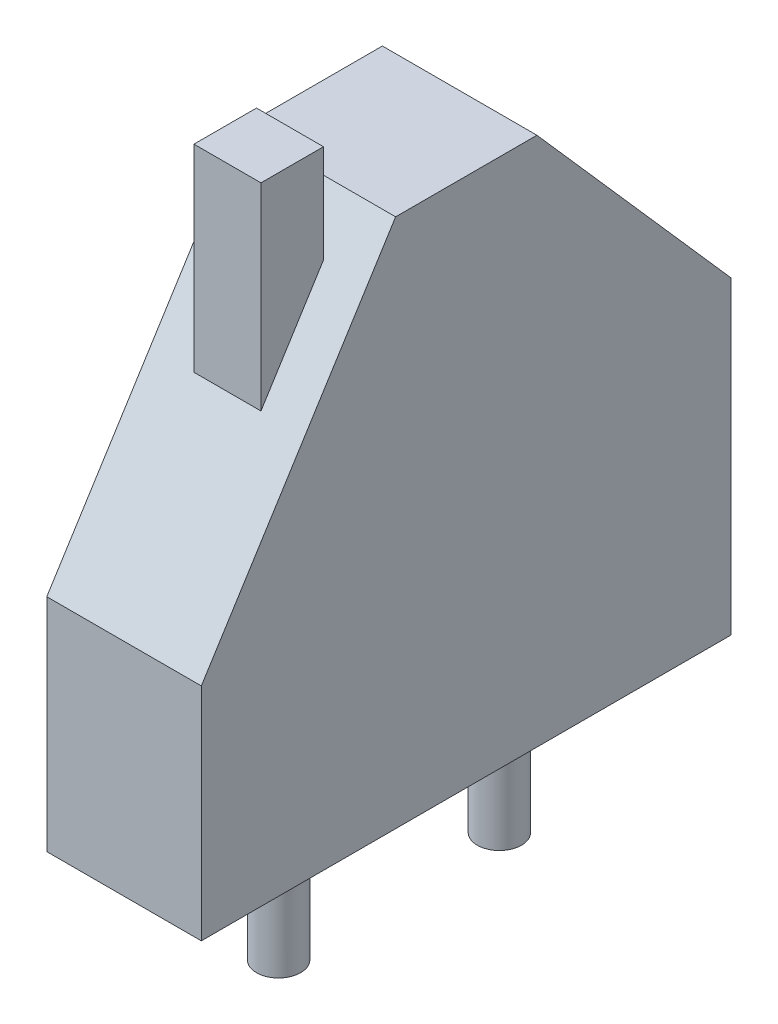
ISO-10303-21;
HEADER;
FILE_DESCRIPTION(('STEP AP214'),'2;1');
FILE_NAME('part.step','',(''),(''),'','','');
FILE_SCHEMA(('AUTOMOTIVE_DESIGN { 1 0 10303 214 1 1 1 1 }'));
ENDSEC;
DATA;
#1=APPLICATION_CONTEXT('core data for automotive mechanical design processes');
#2=APPLICATION_PROTOCOL_DEFINITION('international standard','automotive_design',2000,#1);
#3=PRODUCT_CONTEXT('',#1,'mechanical');
#4=PRODUCT('Part','Part','',(#3));
#5=PRODUCT_RELATED_PRODUCT_CATEGORY('part','',(#4));
#6=PRODUCT_DEFINITION_FORMATION('','',#4);
#7=PRODUCT_DEFINITION_CONTEXT('part definition',#1,'design');
#8=PRODUCT_DEFINITION('design','',#6,#7);
#9=PRODUCT_DEFINITION_SHAPE('','',#8);
#10=(LENGTH_UNIT() NAMED_UNIT(*) SI_UNIT(.MILLI.,.METRE.));
#11=(NAMED_UNIT(*) PLANE_ANGLE_UNIT() SI_UNIT($,.RADIAN.));
#12=(NAMED_UNIT(*) SI_UNIT($,.STERADIAN.) SOLID_ANGLE_UNIT());
#13=UNCERTAINTY_MEASURE_WITH_UNIT(LENGTH_MEASURE(1.E-05),#10,'distance_accuracy_value','');
#14=(GEOMETRIC_REPRESENTATION_CONTEXT(3) GLOBAL_UNCERTAINTY_ASSIGNED_CONTEXT((#13)) GLOBAL_UNIT_ASSIGNED_CONTEXT((#10,
#11,#12)) REPRESENTATION_CONTEXT('',''));
#15=CARTESIAN_POINT('',(0.,0.,0.));
#16=DIRECTION('',(0.,0.,1.));
#17=DIRECTION('',(1.,0.,0.));
#18=AXIS2_PLACEMENT_3D('',#15,#16,#17);
#19=CARTESIAN_POINT('',(-1.75,0.,5.99999999999999));
#20=DIRECTION('',(0.,1.,0.));
#21=DIRECTION('',(0.,0.,1.));
#22=AXIS2_PLACEMENT_3D('',#19,#20,#21);
#23=PLANE('',#22);
#24=CARTESIAN_POINT('',(0.,0.,2.5));
#25=DIRECTION('',(0.,1.,0.));
#26=DIRECTION('',(0.,0.,1.));
#27=AXIS2_PLACEMENT_3D('',#24,#25,#26);
#28=CIRCLE('',#27,0.5);
#29=CARTESIAN_POINT('',(0.,0.,3.));
#30=VERTEX_POINT('',#29);
#31=EDGE_CURVE('E184',#30,#30,#28,.F.);
#32=ORIENTED_EDGE('',*,*,#31,.F.);
#33=EDGE_LOOP('',(#32));
#34=FACE_BOUND('',#33,.T.);
#35=DIRECTION('',(0.,0.,1.));
#36=VECTOR('',#35,1.);
#37=CARTESIAN_POINT('',(-1.75,0.,-5.99999999999999));
#38=LINE('',#37,#36);
#39=CARTESIAN_POINT('',(-1.75,0.,-5.99999999999999));
#40=VERTEX_POINT('',#39);
#41=CARTESIAN_POINT('',(-1.75,0.,5.99999999999999));
#42=VERTEX_POINT('',#41);
#43=EDGE_CURVE('E159',#40,#42,#38,.T.);
#44=ORIENTED_EDGE('',*,*,#43,.F.);
#45=DIRECTION('',(-1.,0.,0.));
#46=VECTOR('',#45,1.);
#47=CARTESIAN_POINT('',(-1.75,0.,-5.99999999999999));
#48=LINE('',#47,#46);
#49=CARTESIAN_POINT('',(1.75000000000001,0.,-5.99999999999999));
#50=VERTEX_POINT('',#49);
#51=EDGE_CURVE('E163',#50,#40,#48,.T.);
#52=ORIENTED_EDGE('',*,*,#51,.F.);
#53=DIRECTION('',(0.,0.,-1.));
#54=VECTOR('',#53,1.);
#55=CARTESIAN_POINT('',(1.75000000000001,0.,-5.99999999999999));
#56=LINE('',#55,#54);
#57=CARTESIAN_POINT('',(1.75000000000001,0.,5.99999999999999));
#58=VERTEX_POINT('',#57);
#59=EDGE_CURVE('E172',#58,#50,#56,.T.);
#60=ORIENTED_EDGE('',*,*,#59,.F.);
#61=DIRECTION('',(1.,0.,0.));
#62=VECTOR('',#61,1.);
#63=CARTESIAN_POINT('',(-1.75,0.,5.99999999999999));
#64=LINE('',#63,#62);
#65=EDGE_CURVE('E169',#42,#58,#64,.T.);
#66=ORIENTED_EDGE('',*,*,#65,.F.);
#67=EDGE_LOOP('',(#44,#52,#60,#66));
#68=FACE_BOUND('',#67,.T.);
#69=CARTESIAN_POINT('',(0.,0.,-2.5));
#70=DIRECTION('',(0.,1.,0.));
#71=DIRECTION('',(0.,0.,1.));
#72=AXIS2_PLACEMENT_3D('',#69,#70,#71);
#73=CIRCLE('',#72,0.5);
#74=CARTESIAN_POINT('',(0.,0.,-2.));
#75=VERTEX_POINT('',#74);
#76=EDGE_CURVE('E187',#75,#75,#73,.F.);
#77=ORIENTED_EDGE('',*,*,#76,.F.);
#78=EDGE_LOOP('',(#77));
#79=FACE_BOUND('',#78,.T.);
#80=ADVANCED_FACE('F33',(#34,#68,#79),#23,.F.);
#81=CARTESIAN_POINT('',(-1.75,12.,-5.99999999999999));
#82=DIRECTION('',(1.,0.,0.));
#83=DIRECTION('',(0.,0.,-1.));
#84=AXIS2_PLACEMENT_3D('',#81,#82,#83);
#85=PLANE('',#84);
#86=DIRECTION('',(0.,0.,1.));
#87=VECTOR('',#86,1.);
#88=CARTESIAN_POINT('',(-1.75,12.,-5.99999999999999));
#89=LINE('',#88,#87);
#90=CARTESIAN_POINT('',(-1.75,12.,-1.6));
#91=VERTEX_POINT('',#90);
#92=CARTESIAN_POINT('',(-1.75,12.,1.6));
#93=VERTEX_POINT('',#92);
#94=EDGE_CURVE('E160',#91,#93,#89,.T.);
#95=ORIENTED_EDGE('',*,*,#94,.F.);
#96=DIRECTION('',(0.,-0.750713516922756,-0.660627894892024));
#97=VECTOR('',#96,1.);
#98=CARTESIAN_POINT('',(-1.75,9.81785392245266,-3.52028854824165));
#99=LINE('',#98,#97);
#100=CARTESIAN_POINT('',(-1.75,7.,-5.99999999999999));
#101=VERTEX_POINT('',#100);
#102=EDGE_CURVE('E56',#91,#101,#99,.T.);
#103=ORIENTED_EDGE('',*,*,#102,.T.);
#104=DIRECTION('',(0.,-1.,0.));
#105=VECTOR('',#104,1.);
#106=CARTESIAN_POINT('',(-1.75,12.,-5.99999999999999));
#107=LINE('',#106,#105);
#108=EDGE_CURVE('E166',#101,#40,#107,.T.);
#109=ORIENTED_EDGE('',*,*,#108,.T.);
#110=ORIENTED_EDGE('',*,*,#43,.T.);
#111=DIRECTION('',(0.,-1.,0.));
#112=VECTOR('',#111,1.);
#113=CARTESIAN_POINT('',(-1.75,12.,5.99999999999999));
#114=LINE('',#113,#112);
#115=CARTESIAN_POINT('',(-1.75,5.,5.99999999999999));
#116=VERTEX_POINT('',#115);
#117=EDGE_CURVE('E182',#116,#42,#114,.T.);
#118=ORIENTED_EDGE('',*,*,#117,.F.);
#119=DIRECTION('',(0.,0.846636549211005,-0.532171545218345));
#120=VECTOR('',#119,1.);
#121=CARTESIAN_POINT('',(-1.75,15.4242246928028,-0.552369806904613));
#122=LINE('',#121,#120);
#123=EDGE_CURVE('E150',#116,#93,#122,.T.);
#124=ORIENTED_EDGE('',*,*,#123,.T.);
#125=EDGE_LOOP('',(#95,#103,#109,#110,#118,#124));
#126=FACE_BOUND('',#125,.T.);
#127=ADVANCED_FACE('F35',(#126),#85,.F.);
#128=CARTESIAN_POINT('',(-1.75,12.,5.99999999999999));
#129=DIRECTION('',(0.,0.,-1.));
#130=DIRECTION('',(-1.,0.,0.));
#131=AXIS2_PLACEMENT_3D('',#128,#129,#130);
#132=PLANE('',#131);
#133=DIRECTION('',(0.,-1.,0.));
#134=VECTOR('',#133,1.);
#135=CARTESIAN_POINT('',(1.75000000000001,12.,5.99999999999999));
#136=LINE('',#135,#134);
#137=CARTESIAN_POINT('',(1.75000000000001,5.,5.99999999999999));
#138=VERTEX_POINT('',#137);
#139=EDGE_CURVE('E180',#138,#58,#136,.T.);
#140=ORIENTED_EDGE('',*,*,#139,.F.);
#141=DIRECTION('',(1.,0.,0.));
#142=VECTOR('',#141,1.);
#143=CARTESIAN_POINT('',(-3.24999999999999,5.,5.99999999999999));
#144=LINE('',#143,#142);
#145=EDGE_CURVE('E148',#116,#138,#144,.T.);
#146=ORIENTED_EDGE('',*,*,#145,.F.);
#147=ORIENTED_EDGE('',*,*,#117,.T.);
#148=ORIENTED_EDGE('',*,*,#65,.T.);
#149=EDGE_LOOP('',(#140,#146,#147,#148));
#150=FACE_BOUND('',#149,.T.);
#151=ADVANCED_FACE('F220',(#150),#132,.F.);
#152=CARTESIAN_POINT('',(1.75000000000001,12.,-5.99999999999999));
#153=DIRECTION('',(-1.,0.,0.));
#154=DIRECTION('',(0.,0.,1.));
#155=AXIS2_PLACEMENT_3D('',#152,#153,#154);
#156=PLANE('',#155);
#157=DIRECTION('',(0.,-1.,0.));
#158=VECTOR('',#157,1.);
#159=CARTESIAN_POINT('',(1.75000000000001,12.,-5.99999999999999));
#160=LINE('',#159,#158);
#161=CARTESIAN_POINT('',(1.75000000000001,7.,-5.99999999999999));
#162=VERTEX_POINT('',#161);
#163=EDGE_CURVE('E178',#162,#50,#160,.T.);
#164=ORIENTED_EDGE('',*,*,#163,.F.);
#165=DIRECTION('',(0.,-0.750713516922756,-0.660627894892024));
#166=VECTOR('',#165,1.);
#167=CARTESIAN_POINT('',(1.75000000000001,12.,-1.6));
#168=LINE('',#167,#166);
#169=CARTESIAN_POINT('',(1.75000000000001,12.,-1.6));
#170=VERTEX_POINT('',#169);
#171=EDGE_CURVE('E136',#170,#162,#168,.T.);
#172=ORIENTED_EDGE('',*,*,#171,.F.);
#173=DIRECTION('',(0.,0.,-1.));
#174=VECTOR('',#173,1.);
#175=CARTESIAN_POINT('',(1.75000000000001,12.,-5.99999999999999));
#176=LINE('',#175,#174);
#177=CARTESIAN_POINT('',(1.75000000000001,12.,1.6));
#178=VERTEX_POINT('',#177);
#179=EDGE_CURVE('E162',#178,#170,#176,.T.);
#180=ORIENTED_EDGE('',*,*,#179,.F.);
#181=DIRECTION('',(0.,0.846636549211005,-0.532171545218345));
#182=VECTOR('',#181,1.);
#183=CARTESIAN_POINT('',(1.75000000000001,12.,1.6));
#184=LINE('',#183,#182);
#185=EDGE_CURVE('E146',#138,#178,#184,.T.);
#186=ORIENTED_EDGE('',*,*,#185,.F.);
#187=ORIENTED_EDGE('',*,*,#139,.T.);
#188=ORIENTED_EDGE('',*,*,#59,.T.);
#189=EDGE_LOOP('',(#164,#172,#180,#186,#187,#188));
#190=FACE_BOUND('',#189,.T.);
#191=ADVANCED_FACE('F231',(#190),#156,.F.);
#192=CARTESIAN_POINT('',(-1.75,12.,-5.99999999999999));
#193=DIRECTION('',(0.,0.,1.));
#194=DIRECTION('',(1.,0.,0.));
#195=AXIS2_PLACEMENT_3D('',#192,#193,#194);
#196=PLANE('',#195);
#197=ORIENTED_EDGE('',*,*,#108,.F.);
#198=DIRECTION('',(1.,0.,0.));
#199=VECTOR('',#198,1.);
#200=CARTESIAN_POINT('',(-3.24999999999999,7.,-5.99999999999999));
#201=LINE('',#200,#199);
#202=EDGE_CURVE('E142',#101,#162,#201,.T.);
#203=ORIENTED_EDGE('',*,*,#202,.T.);
#204=ORIENTED_EDGE('',*,*,#163,.T.);
#205=ORIENTED_EDGE('',*,*,#51,.T.);
#206=EDGE_LOOP('',(#197,#203,#204,#205));
#207=FACE_BOUND('',#206,.T.);
#208=ADVANCED_FACE('F228',(#207),#196,.F.);
#209=CARTESIAN_POINT('',(-1.75,12.,5.99999999999999));
#210=DIRECTION('',(0.,1.,0.));
#211=DIRECTION('',(0.,0.,1.));
#212=AXIS2_PLACEMENT_3D('',#209,#210,#211);
#213=PLANE('',#212);
#214=DIRECTION('',(1.,0.,0.));
#215=VECTOR('',#214,1.);
#216=CARTESIAN_POINT('',(-1.75000000000001,12.,-1.6));
#217=LINE('',#216,#215);
#218=EDGE_CURVE('E193',#91,#170,#217,.T.);
#219=ORIENTED_EDGE('',*,*,#218,.F.);
#220=ORIENTED_EDGE('',*,*,#94,.T.);
#221=DIRECTION('',(-1.,0.,0.));
#222=VECTOR('',#221,1.);
#223=CARTESIAN_POINT('',(-1.75,12.,1.6));
#224=LINE('',#223,#222);
#225=EDGE_CURVE('E190',#178,#93,#224,.T.);
#226=ORIENTED_EDGE('',*,*,#225,.F.);
#227=ORIENTED_EDGE('',*,*,#179,.T.);
#228=EDGE_LOOP('',(#219,#220,#226,#227));
#229=FACE_BOUND('',#228,.T.);
#230=ADVANCED_FACE('F226',(#229),#213,.T.);
#231=CARTESIAN_POINT('',(0.,-3.,2.5));
#232=DIRECTION('',(0.,1.,0.));
#233=DIRECTION('',(0.,0.,1.));
#234=AXIS2_PLACEMENT_3D('',#231,#232,#233);
#235=CYLINDRICAL_SURFACE('',#234,0.5);
#236=CARTESIAN_POINT('',(0.,-3.,2.5));
#237=DIRECTION('',(0.,-1.,0.));
#238=DIRECTION('',(0.,0.,-1.));
#239=AXIS2_PLACEMENT_3D('',#236,#237,#238);
#240=CIRCLE('',#239,0.5);
#241=CARTESIAN_POINT('',(0.,-3.,2.));
#242=VERTEX_POINT('',#241);
#243=EDGE_CURVE('E156',#242,#242,#240,.T.);
#244=ORIENTED_EDGE('',*,*,#243,.F.);
#245=EDGE_LOOP('',(#244));
#246=FACE_BOUND('',#245,.T.);
#247=ORIENTED_EDGE('',*,*,#31,.T.);
#248=EDGE_LOOP('',(#247));
#249=FACE_BOUND('',#248,.T.);
#250=ADVANCED_FACE('F275',(#246,#249),#235,.T.);
#251=CARTESIAN_POINT('',(0.,-3.,2.5));
#252=DIRECTION('',(0.,-1.,0.));
#253=DIRECTION('',(0.,0.,-1.));
#254=AXIS2_PLACEMENT_3D('',#251,#252,#253);
#255=PLANE('',#254);
#256=ORIENTED_EDGE('',*,*,#243,.T.);
#257=EDGE_LOOP('',(#256));
#258=FACE_BOUND('',#257,.T.);
#259=ADVANCED_FACE('F272',(#258),#255,.T.);
#260=CARTESIAN_POINT('',(0.,-3.,-2.5));
#261=DIRECTION('',(0.,1.,0.));
#262=DIRECTION('',(0.,0.,1.));
#263=AXIS2_PLACEMENT_3D('',#260,#261,#262);
#264=CYLINDRICAL_SURFACE('',#263,0.5);
#265=CARTESIAN_POINT('',(0.,-3.,-2.5));
#266=DIRECTION('',(0.,-1.,0.));
#267=DIRECTION('',(0.,0.,-1.));
#268=AXIS2_PLACEMENT_3D('',#265,#266,#267);
#269=CIRCLE('',#268,0.5);
#270=CARTESIAN_POINT('',(0.,-3.,-3.));
#271=VERTEX_POINT('',#270);
#272=EDGE_CURVE('E153',#271,#271,#269,.T.);
#273=ORIENTED_EDGE('',*,*,#272,.F.);
#274=EDGE_LOOP('',(#273));
#275=FACE_BOUND('',#274,.T.);
#276=ORIENTED_EDGE('',*,*,#76,.T.);
#277=EDGE_LOOP('',(#276));
#278=FACE_BOUND('',#277,.T.);
#279=ADVANCED_FACE('F268',(#275,#278),#264,.T.);
#280=CARTESIAN_POINT('',(0.,-3.,-2.5));
#281=DIRECTION('',(0.,-1.,0.));
#282=DIRECTION('',(0.,0.,-1.));
#283=AXIS2_PLACEMENT_3D('',#280,#281,#282);
#284=PLANE('',#283);
#285=ORIENTED_EDGE('',*,*,#272,.T.);
#286=EDGE_LOOP('',(#285));
#287=FACE_BOUND('',#286,.T.);
#288=ADVANCED_FACE('F263',(#287),#284,.T.);
#289=CARTESIAN_POINT('',(-3.24999999999999,12.,1.6));
#290=DIRECTION('',(0.,-0.532171545218345,-0.846636549211005));
#291=DIRECTION('',(0.,0.846636549211005,-0.532171545218345));
#292=AXIS2_PLACEMENT_3D('',#289,#290,#291);
#293=PLANE('',#292);
#294=DIRECTION('',(-1.,0.,0.));
#295=VECTOR('',#294,1.);
#296=CARTESIAN_POINT('',(-3.24999999999999,8.72559305547958,3.6581986508414));
#297=LINE('',#296,#295);
#298=CARTESIAN_POINT('',(0.758612623446356,8.72559305547958,3.6581986508414));
#299=VERTEX_POINT('',#298);
#300=CARTESIAN_POINT('',(-0.758612623446356,8.72559305547958,3.6581986508414));
#301=VERTEX_POINT('',#300);
#302=EDGE_CURVE('E41',#299,#301,#297,.T.);
#303=ORIENTED_EDGE('',*,*,#302,.T.);
#304=DIRECTION('',(0.,0.846636549211005,-0.532171545218345));
#305=VECTOR('',#304,1.);
#306=CARTESIAN_POINT('',(-0.758612623446356,12.,1.6));
#307=LINE('',#306,#305);
#308=CARTESIAN_POINT('',(-0.758612623446356,10.9784426645021,2.24212175374152));
#309=VERTEX_POINT('',#308);
#310=EDGE_CURVE('E11',#301,#309,#307,.T.);
#311=ORIENTED_EDGE('',*,*,#310,.T.);
#312=DIRECTION('',(1.,0.,0.));
#313=VECTOR('',#312,1.);
#314=CARTESIAN_POINT('',(-3.24999999999999,10.9784426645021,2.24212175374152));
#315=LINE('',#314,#313);
#316=CARTESIAN_POINT('',(0.758612623446356,10.9784426645021,2.24212175374152));
#317=VERTEX_POINT('',#316);
#318=EDGE_CURVE('E113',#309,#317,#315,.T.);
#319=ORIENTED_EDGE('',*,*,#318,.T.);
#320=DIRECTION('',(0.,-0.846636549211005,0.532171545218345));
#321=VECTOR('',#320,1.);
#322=CARTESIAN_POINT('',(0.758612623446356,12.,1.6));
#323=LINE('',#322,#321);
#324=EDGE_CURVE('E196',#317,#299,#323,.T.);
#325=ORIENTED_EDGE('',*,*,#324,.T.);
#326=EDGE_LOOP('',(#303,#311,#319,#325));
#327=FACE_BOUND('',#326,.T.);
#328=ORIENTED_EDGE('',*,*,#145,.T.);
#329=ORIENTED_EDGE('',*,*,#185,.T.);
#330=ORIENTED_EDGE('',*,*,#225,.T.);
#331=ORIENTED_EDGE('',*,*,#123,.F.);
#332=EDGE_LOOP('',(#328,#329,#330,#331));
#333=FACE_BOUND('',#332,.T.);
#334=ADVANCED_FACE('F200',(#327,#333),#293,.F.);
#335=CARTESIAN_POINT('',(-3.24999999999999,12.,-1.6));
#336=DIRECTION('',(0.,-0.660627894892024,0.750713516922756));
#337=DIRECTION('',(0.,-0.750713516922756,-0.660627894892024));
#338=AXIS2_PLACEMENT_3D('',#335,#336,#337);
#339=PLANE('',#338);
#340=ORIENTED_EDGE('',*,*,#218,.T.);
#341=ORIENTED_EDGE('',*,*,#171,.T.);
#342=ORIENTED_EDGE('',*,*,#202,.F.);
#343=ORIENTED_EDGE('',*,*,#102,.F.);
#344=EDGE_LOOP('',(#340,#341,#342,#343));
#345=FACE_BOUND('',#344,.T.);
#346=ADVANCED_FACE('F255',(#345),#339,.F.);
#347=CARTESIAN_POINT('',(-0.758612623446356,13.2,3.6581986508414));
#348=DIRECTION('',(-1.,0.,0.));
#349=DIRECTION('',(0.,0.,1.));
#350=AXIS2_PLACEMENT_3D('',#347,#348,#349);
#351=PLANE('',#350);
#352=ORIENTED_EDGE('',*,*,#310,.F.);
#353=DIRECTION('',(0.,-1.,0.));
#354=VECTOR('',#353,1.);
#355=CARTESIAN_POINT('',(-0.758612623446356,13.2,3.6581986508414));
#356=LINE('',#355,#354);
#357=CARTESIAN_POINT('',(-0.758612623446356,13.2,3.6581986508414));
#358=VERTEX_POINT('',#357);
#359=EDGE_CURVE('E130',#358,#301,#356,.T.);
#360=ORIENTED_EDGE('',*,*,#359,.F.);
#361=DIRECTION('',(0.,0.,-1.));
#362=VECTOR('',#361,1.);
#363=CARTESIAN_POINT('',(-0.758612623446356,13.2,3.6581986508414));
#364=LINE('',#363,#362);
#365=CARTESIAN_POINT('',(-0.758612623446356,13.2,2.24212175374152));
#366=VERTEX_POINT('',#365);
#367=EDGE_CURVE('E123',#358,#366,#364,.T.);
#368=ORIENTED_EDGE('',*,*,#367,.T.);
#369=DIRECTION('',(0.,-1.,0.));
#370=VECTOR('',#369,1.);
#371=CARTESIAN_POINT('',(-0.758612623446356,13.2,2.24212175374152));
#372=LINE('',#371,#370);
#373=EDGE_CURVE('E108',#366,#309,#372,.T.);
#374=ORIENTED_EDGE('',*,*,#373,.T.);
#375=EDGE_LOOP('',(#352,#360,#368,#374));
#376=FACE_BOUND('',#375,.T.);
#377=ADVANCED_FACE('F128',(#376),#351,.T.);
#378=CARTESIAN_POINT('',(-0.758612623446356,13.2,3.6581986508414));
#379=DIRECTION('',(0.,0.,1.));
#380=DIRECTION('',(1.,0.,0.));
#381=AXIS2_PLACEMENT_3D('',#378,#379,#380);
#382=PLANE('',#381);
#383=ORIENTED_EDGE('',*,*,#302,.F.);
#384=DIRECTION('',(0.,-1.,0.));
#385=VECTOR('',#384,1.);
#386=CARTESIAN_POINT('',(0.758612623446356,13.2,3.6581986508414));
#387=LINE('',#386,#385);
#388=CARTESIAN_POINT('',(0.758612623446356,13.2,3.6581986508414));
#389=VERTEX_POINT('',#388);
#390=EDGE_CURVE('E137',#389,#299,#387,.T.);
#391=ORIENTED_EDGE('',*,*,#390,.F.);
#392=DIRECTION('',(-1.,0.,0.));
#393=VECTOR('',#392,1.);
#394=CARTESIAN_POINT('',(-0.758612623446356,13.2,3.6581986508414));
#395=LINE('',#394,#393);
#396=EDGE_CURVE('E116',#389,#358,#395,.T.);
#397=ORIENTED_EDGE('',*,*,#396,.T.);
#398=ORIENTED_EDGE('',*,*,#359,.T.);
#399=EDGE_LOOP('',(#383,#391,#397,#398));
#400=FACE_BOUND('',#399,.T.);
#401=ADVANCED_FACE('F203',(#400),#382,.T.);
#402=CARTESIAN_POINT('',(0.758612623446356,13.2,3.6581986508414));
#403=DIRECTION('',(1.,0.,0.));
#404=DIRECTION('',(0.,0.,-1.));
#405=AXIS2_PLACEMENT_3D('',#402,#403,#404);
#406=PLANE('',#405);
#407=ORIENTED_EDGE('',*,*,#324,.F.);
#408=DIRECTION('',(0.,-1.,0.));
#409=VECTOR('',#408,1.);
#410=CARTESIAN_POINT('',(0.758612623446356,13.2,2.24212175374152));
#411=LINE('',#410,#409);
#412=CARTESIAN_POINT('',(0.758612623446356,13.2,2.24212175374152));
#413=VERTEX_POINT('',#412);
#414=EDGE_CURVE('E48',#413,#317,#411,.T.);
#415=ORIENTED_EDGE('',*,*,#414,.F.);
#416=DIRECTION('',(0.,0.,1.));
#417=VECTOR('',#416,1.);
#418=CARTESIAN_POINT('',(0.758612623446356,13.2,3.6581986508414));
#419=LINE('',#418,#417);
#420=EDGE_CURVE('E126',#413,#389,#419,.T.);
#421=ORIENTED_EDGE('',*,*,#420,.T.);
#422=ORIENTED_EDGE('',*,*,#390,.T.);
#423=EDGE_LOOP('',(#407,#415,#421,#422));
#424=FACE_BOUND('',#423,.T.);
#425=ADVANCED_FACE('F205',(#424),#406,.T.);
#426=CARTESIAN_POINT('',(-0.758612623446356,13.2,2.24212175374152));
#427=DIRECTION('',(0.,0.,-1.));
#428=DIRECTION('',(-1.,0.,0.));
#429=AXIS2_PLACEMENT_3D('',#426,#427,#428);
#430=PLANE('',#429);
#431=ORIENTED_EDGE('',*,*,#318,.F.);
#432=ORIENTED_EDGE('',*,*,#373,.F.);
#433=DIRECTION('',(1.,0.,0.));
#434=VECTOR('',#433,1.);
#435=CARTESIAN_POINT('',(-0.758612623446356,13.2,2.24212175374152));
#436=LINE('',#435,#434);
#437=EDGE_CURVE('E111',#366,#413,#436,.T.);
#438=ORIENTED_EDGE('',*,*,#437,.T.);
#439=ORIENTED_EDGE('',*,*,#414,.T.);
#440=EDGE_LOOP('',(#431,#432,#438,#439));
#441=FACE_BOUND('',#440,.T.);
#442=ADVANCED_FACE('F110',(#441),#430,.T.);
#443=CARTESIAN_POINT('',(0.,13.2,0.));
#444=DIRECTION('',(0.,-1.,0.));
#445=DIRECTION('',(0.,0.,-1.));
#446=AXIS2_PLACEMENT_3D('',#443,#444,#445);
#447=PLANE('',#446);
#448=ORIENTED_EDGE('',*,*,#367,.F.);
#449=ORIENTED_EDGE('',*,*,#396,.F.);
#450=ORIENTED_EDGE('',*,*,#420,.F.);
#451=ORIENTED_EDGE('',*,*,#437,.F.);
#452=EDGE_LOOP('',(#448,#449,#450,#451));
#453=FACE_BOUND('',#452,.T.);
#454=ADVANCED_FACE('F121',(#453),#447,.F.);
#455=CLOSED_SHELL('',(#80,#127,#151,#191,#208,#230,#250,#259,#279,#288,#334,#346,#377,#401,#425,
#442,#454));
#456=MANIFOLD_SOLID_BREP('B2',#455);
#457=ADVANCED_BREP_SHAPE_REPRESENTATION('',(#18,#456),#14);
#458=SHAPE_DEFINITION_REPRESENTATION(#9,#457);
ENDSEC;
END-ISO-10303-21;
